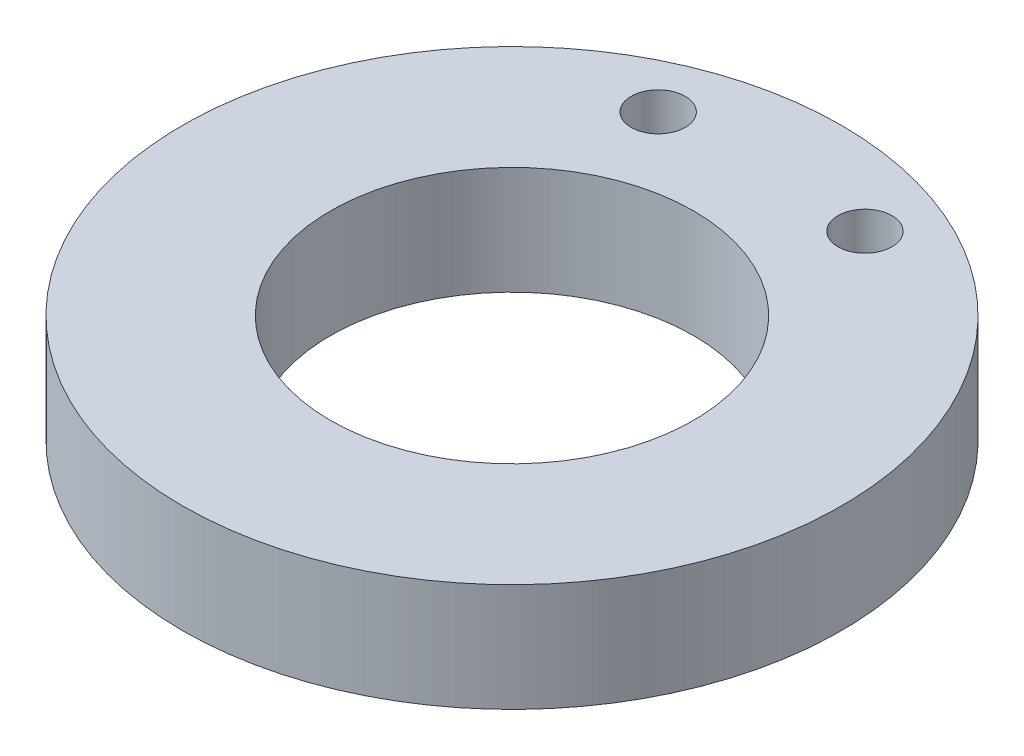
ISO-10303-21;
HEADER;
FILE_DESCRIPTION(('STEP AP214'),'2;1');
FILE_NAME('part.step','',(''),(''),'','','');
FILE_SCHEMA(('AUTOMOTIVE_DESIGN { 1 0 10303 214 1 1 1 1 }'));
ENDSEC;
DATA;
#1=APPLICATION_CONTEXT('core data for automotive mechanical design processes');
#2=APPLICATION_PROTOCOL_DEFINITION('international standard','automotive_design',2000,#1);
#3=PRODUCT_CONTEXT('',#1,'mechanical');
#4=PRODUCT('Part','Part','',(#3));
#5=PRODUCT_RELATED_PRODUCT_CATEGORY('part','',(#4));
#6=PRODUCT_DEFINITION_FORMATION('','',#4);
#7=PRODUCT_DEFINITION_CONTEXT('part definition',#1,'design');
#8=PRODUCT_DEFINITION('design','',#6,#7);
#9=PRODUCT_DEFINITION_SHAPE('','',#8);
#10=(LENGTH_UNIT() NAMED_UNIT(*) SI_UNIT(.MILLI.,.METRE.));
#11=(NAMED_UNIT(*) PLANE_ANGLE_UNIT() SI_UNIT($,.RADIAN.));
#12=(NAMED_UNIT(*) SI_UNIT($,.STERADIAN.) SOLID_ANGLE_UNIT());
#13=UNCERTAINTY_MEASURE_WITH_UNIT(LENGTH_MEASURE(1.E-05),#10,'distance_accuracy_value','');
#14=(GEOMETRIC_REPRESENTATION_CONTEXT(3) GLOBAL_UNCERTAINTY_ASSIGNED_CONTEXT((#13)) GLOBAL_UNIT_ASSIGNED_CONTEXT((#10,
#11,#12)) REPRESENTATION_CONTEXT('',''));
#15=CARTESIAN_POINT('',(0.,0.,0.));
#16=DIRECTION('',(0.,0.,1.));
#17=DIRECTION('',(1.,0.,0.));
#18=AXIS2_PLACEMENT_3D('',#15,#16,#17);
#19=CARTESIAN_POINT('',(0.,10.,0.));
#20=DIRECTION('',(0.,1.,0.));
#21=DIRECTION('',(0.,0.,1.));
#22=AXIS2_PLACEMENT_3D('',#19,#20,#21);
#23=PLANE('',#22);
#24=CARTESIAN_POINT('',(9.56708580912727,10.,-23.0969883127822));
#25=DIRECTION('',(0.,1.,0.));
#26=DIRECTION('',(0.,0.,1.));
#27=AXIS2_PLACEMENT_3D('',#24,#25,#26);
#28=CIRCLE('',#27,2.5);
#29=CARTESIAN_POINT('',(9.56708580912727,10.,-20.5969883127822));
#30=VERTEX_POINT('',#29);
#31=EDGE_CURVE('E51',#30,#30,#28,.T.);
#32=ORIENTED_EDGE('',*,*,#31,.F.);
#33=EDGE_LOOP('',(#32));
#34=FACE_BOUND('',#33,.T.);
#35=CARTESIAN_POINT('',(0.,10.,0.));
#36=DIRECTION('',(0.,1.,0.));
#37=DIRECTION('',(0.,0.,1.));
#38=AXIS2_PLACEMENT_3D('',#35,#36,#37);
#39=CIRCLE('',#38,30.5);
#40=CARTESIAN_POINT('',(0.,10.,30.5));
#41=VERTEX_POINT('',#40);
#42=EDGE_CURVE('E10',#41,#41,#39,.T.);
#43=ORIENTED_EDGE('',*,*,#42,.T.);
#44=EDGE_LOOP('',(#43));
#45=FACE_BOUND('',#44,.T.);
#46=CARTESIAN_POINT('',(0.,10.,0.));
#47=DIRECTION('',(0.,1.,0.));
#48=DIRECTION('',(0.,0.,1.));
#49=AXIS2_PLACEMENT_3D('',#46,#47,#48);
#50=CIRCLE('',#49,16.8);
#51=CARTESIAN_POINT('',(0.,10.,16.8));
#52=VERTEX_POINT('',#51);
#53=EDGE_CURVE('E46',#52,#52,#50,.T.);
#54=ORIENTED_EDGE('',*,*,#53,.F.);
#55=EDGE_LOOP('',(#54));
#56=FACE_BOUND('',#55,.T.);
#57=CARTESIAN_POINT('',(-9.56708580912727,10.,-23.0969883127821));
#58=DIRECTION('',(0.,1.,0.));
#59=DIRECTION('',(0.,0.,-1.));
#60=AXIS2_PLACEMENT_3D('',#57,#58,#59);
#61=CIRCLE('',#60,2.5);
#62=CARTESIAN_POINT('',(-9.56708580912727,10.,-25.5969883127821));
#63=VERTEX_POINT('',#62);
#64=EDGE_CURVE('E57',#63,#63,#61,.T.);
#65=ORIENTED_EDGE('',*,*,#64,.F.);
#66=EDGE_LOOP('',(#65));
#67=FACE_BOUND('',#66,.T.);
#68=ADVANCED_FACE('F35',(#34,#45,#56,#67),#23,.T.);
#69=CARTESIAN_POINT('',(0.,0.,0.));
#70=DIRECTION('',(0.,1.,0.));
#71=DIRECTION('',(0.,0.,1.));
#72=AXIS2_PLACEMENT_3D('',#69,#70,#71);
#73=PLANE('',#72);
#74=CARTESIAN_POINT('',(0.,0.,0.));
#75=DIRECTION('',(0.,1.,0.));
#76=DIRECTION('',(0.,0.,1.));
#77=AXIS2_PLACEMENT_3D('',#74,#75,#76);
#78=CIRCLE('',#77,30.5);
#79=CARTESIAN_POINT('',(0.,0.,30.5));
#80=VERTEX_POINT('',#79);
#81=EDGE_CURVE('E39',#80,#80,#78,.T.);
#82=ORIENTED_EDGE('',*,*,#81,.F.);
#83=EDGE_LOOP('',(#82));
#84=FACE_BOUND('',#83,.T.);
#85=CARTESIAN_POINT('',(0.,0.,0.));
#86=DIRECTION('',(0.,1.,0.));
#87=DIRECTION('',(0.,0.,1.));
#88=AXIS2_PLACEMENT_3D('',#85,#86,#87);
#89=CIRCLE('',#88,16.8);
#90=CARTESIAN_POINT('',(0.,0.,16.8));
#91=VERTEX_POINT('',#90);
#92=EDGE_CURVE('E48',#91,#91,#89,.T.);
#93=ORIENTED_EDGE('',*,*,#92,.T.);
#94=EDGE_LOOP('',(#93));
#95=FACE_BOUND('',#94,.T.);
#96=CARTESIAN_POINT('',(9.56708580912727,0.,-23.0969883127822));
#97=DIRECTION('',(0.,1.,0.));
#98=DIRECTION('',(0.,0.,1.));
#99=AXIS2_PLACEMENT_3D('',#96,#97,#98);
#100=CIRCLE('',#99,2.5);
#101=CARTESIAN_POINT('',(9.56708580912727,0.,-20.5969883127822));
#102=VERTEX_POINT('',#101);
#103=EDGE_CURVE('E54',#102,#102,#100,.T.);
#104=ORIENTED_EDGE('',*,*,#103,.T.);
#105=EDGE_LOOP('',(#104));
#106=FACE_BOUND('',#105,.T.);
#107=CARTESIAN_POINT('',(-9.56708580912727,0.,-23.0969883127821));
#108=DIRECTION('',(0.,1.,0.));
#109=DIRECTION('',(0.,0.,-1.));
#110=AXIS2_PLACEMENT_3D('',#107,#108,#109);
#111=CIRCLE('',#110,2.5);
#112=CARTESIAN_POINT('',(-9.56708580912727,0.,-25.5969883127821));
#113=VERTEX_POINT('',#112);
#114=EDGE_CURVE('E60',#113,#113,#111,.T.);
#115=ORIENTED_EDGE('',*,*,#114,.T.);
#116=EDGE_LOOP('',(#115));
#117=FACE_BOUND('',#116,.T.);
#118=ADVANCED_FACE('F70',(#84,#95,#106,#117),#73,.F.);
#119=CARTESIAN_POINT('',(0.,10.,0.));
#120=DIRECTION('',(0.,-1.,0.));
#121=DIRECTION('',(0.,0.,-1.));
#122=AXIS2_PLACEMENT_3D('',#119,#120,#121);
#123=CYLINDRICAL_SURFACE('',#122,30.5);
#124=ORIENTED_EDGE('',*,*,#42,.F.);
#125=EDGE_LOOP('',(#124));
#126=FACE_BOUND('',#125,.T.);
#127=ORIENTED_EDGE('',*,*,#81,.T.);
#128=EDGE_LOOP('',(#127));
#129=FACE_BOUND('',#128,.T.);
#130=ADVANCED_FACE('F37',(#126,#129),#123,.T.);
#131=CARTESIAN_POINT('',(0.,10.,0.));
#132=DIRECTION('',(0.,-1.,0.));
#133=DIRECTION('',(0.,0.,-1.));
#134=AXIS2_PLACEMENT_3D('',#131,#132,#133);
#135=CYLINDRICAL_SURFACE('',#134,16.8);
#136=ORIENTED_EDGE('',*,*,#53,.T.);
#137=EDGE_LOOP('',(#136));
#138=FACE_BOUND('',#137,.T.);
#139=ORIENTED_EDGE('',*,*,#92,.F.);
#140=EDGE_LOOP('',(#139));
#141=FACE_BOUND('',#140,.T.);
#142=ADVANCED_FACE('F79',(#138,#141),#135,.F.);
#143=CARTESIAN_POINT('',(9.56708580912727,10.,-23.0969883127822));
#144=DIRECTION('',(0.,-1.,0.));
#145=DIRECTION('',(0.,0.,-1.));
#146=AXIS2_PLACEMENT_3D('',#143,#144,#145);
#147=CYLINDRICAL_SURFACE('',#146,2.5);
#148=ORIENTED_EDGE('',*,*,#31,.T.);
#149=EDGE_LOOP('',(#148));
#150=FACE_BOUND('',#149,.T.);
#151=ORIENTED_EDGE('',*,*,#103,.F.);
#152=EDGE_LOOP('',(#151));
#153=FACE_BOUND('',#152,.T.);
#154=ADVANCED_FACE('F82',(#150,#153),#147,.F.);
#155=CARTESIAN_POINT('',(-9.56708580912727,10.,-23.0969883127821));
#156=DIRECTION('',(0.,-1.,0.));
#157=DIRECTION('',(0.,0.,-1.));
#158=AXIS2_PLACEMENT_3D('',#155,#156,#157);
#159=CYLINDRICAL_SURFACE('',#158,2.5);
#160=ORIENTED_EDGE('',*,*,#64,.T.);
#161=EDGE_LOOP('',(#160));
#162=FACE_BOUND('',#161,.T.);
#163=ORIENTED_EDGE('',*,*,#114,.F.);
#164=EDGE_LOOP('',(#163));
#165=FACE_BOUND('',#164,.T.);
#166=ADVANCED_FACE('F66',(#162,#165),#159,.F.);
#167=CLOSED_SHELL('',(#68,#118,#130,#142,#154,#166));
#168=MANIFOLD_SOLID_BREP('B2',#167);
#169=ADVANCED_BREP_SHAPE_REPRESENTATION('',(#18,#168),#14);
#170=SHAPE_DEFINITION_REPRESENTATION(#9,#169);
ENDSEC;
END-ISO-10303-21;
